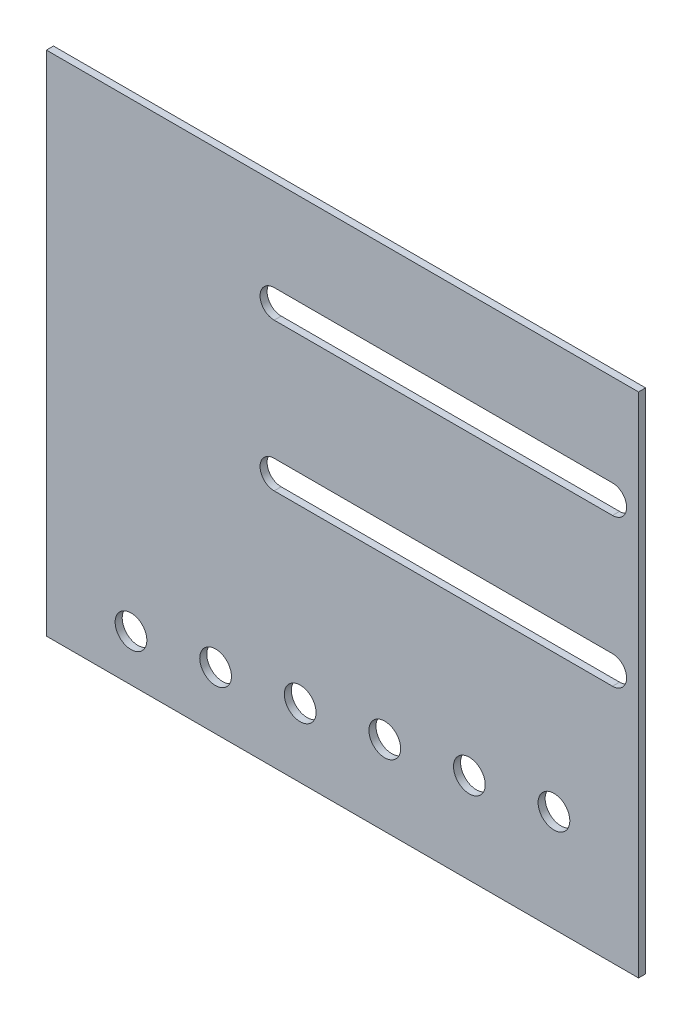
ISO-10303-21;
HEADER;
FILE_DESCRIPTION(('STEP AP214'),'2;1');
FILE_NAME('part.step','',(''),(''),'','','');
FILE_SCHEMA(('AUTOMOTIVE_DESIGN { 1 0 10303 214 1 1 1 1 }'));
ENDSEC;
DATA;
#1=APPLICATION_CONTEXT('core data for automotive mechanical design processes');
#2=APPLICATION_PROTOCOL_DEFINITION('international standard','automotive_design',2000,#1);
#3=PRODUCT_CONTEXT('',#1,'mechanical');
#4=PRODUCT('Part','Part','',(#3));
#5=PRODUCT_RELATED_PRODUCT_CATEGORY('part','',(#4));
#6=PRODUCT_DEFINITION_FORMATION('','',#4);
#7=PRODUCT_DEFINITION_CONTEXT('part definition',#1,'design');
#8=PRODUCT_DEFINITION('design','',#6,#7);
#9=PRODUCT_DEFINITION_SHAPE('','',#8);
#10=(LENGTH_UNIT() NAMED_UNIT(*) SI_UNIT(.MILLI.,.METRE.));
#11=(NAMED_UNIT(*) PLANE_ANGLE_UNIT() SI_UNIT($,.RADIAN.));
#12=(NAMED_UNIT(*) SI_UNIT($,.STERADIAN.) SOLID_ANGLE_UNIT());
#13=UNCERTAINTY_MEASURE_WITH_UNIT(LENGTH_MEASURE(1.E-05),#10,'distance_accuracy_value','');
#14=(GEOMETRIC_REPRESENTATION_CONTEXT(3) GLOBAL_UNCERTAINTY_ASSIGNED_CONTEXT((#13)) GLOBAL_UNIT_ASSIGNED_CONTEXT((#10,
#11,#12)) REPRESENTATION_CONTEXT('',''));
#15=CARTESIAN_POINT('',(0.,0.,0.));
#16=DIRECTION('',(0.,0.,1.));
#17=DIRECTION('',(1.,0.,0.));
#18=AXIS2_PLACEMENT_3D('',#15,#16,#17);
#19=CARTESIAN_POINT('',(0.,0.,6.35));
#20=DIRECTION('',(0.,0.,-1.));
#21=DIRECTION('',(-1.,0.,0.));
#22=AXIS2_PLACEMENT_3D('',#19,#20,#21);
#23=PLANE('',#22);
#24=CARTESIAN_POINT('',(190.5,-136.944186204987,6.35));
#25=DIRECTION('',(0.,0.,-1.));
#26=DIRECTION('',(-1.,0.,0.));
#27=AXIS2_PLACEMENT_3D('',#24,#25,#26);
#28=CIRCLE('',#27,14.2875);
#29=CARTESIAN_POINT('',(176.2125,-136.944186204987,6.35));
#30=VERTEX_POINT('',#29);
#31=EDGE_CURVE('E203',#30,#30,#28,.T.);
#32=ORIENTED_EDGE('',*,*,#31,.T.);
#33=EDGE_LOOP('',(#32));
#34=FACE_BOUND('',#33,.T.);
#35=CARTESIAN_POINT('',(114.3,-146.888372409974,6.35));
#36=DIRECTION('',(0.,0.,-1.));
#37=DIRECTION('',(-1.,0.,0.));
#38=AXIS2_PLACEMENT_3D('',#35,#36,#37);
#39=CIRCLE('',#38,14.2875);
#40=CARTESIAN_POINT('',(100.0125,-146.888372409974,6.35));
#41=VERTEX_POINT('',#40);
#42=EDGE_CURVE('E473',#41,#41,#39,.T.);
#43=ORIENTED_EDGE('',*,*,#42,.T.);
#44=EDGE_LOOP('',(#43));
#45=FACE_BOUND('',#44,.T.);
#46=CARTESIAN_POINT('',(38.1,-156.83255861496,6.35));
#47=DIRECTION('',(0.,0.,-1.));
#48=DIRECTION('',(-1.,0.,0.));
#49=AXIS2_PLACEMENT_3D('',#46,#47,#48);
#50=CIRCLE('',#49,14.2875);
#51=CARTESIAN_POINT('',(23.8125,-156.83255861496,6.35));
#52=VERTEX_POINT('',#51);
#53=EDGE_CURVE('E475',#52,#52,#50,.T.);
#54=ORIENTED_EDGE('',*,*,#53,.T.);
#55=EDGE_LOOP('',(#54));
#56=FACE_BOUND('',#55,.T.);
#57=CARTESIAN_POINT('',(-38.0999999999999,-166.776744819947,6.35));
#58=DIRECTION('',(0.,0.,-1.));
#59=DIRECTION('',(-1.,0.,0.));
#60=AXIS2_PLACEMENT_3D('',#57,#58,#59);
#61=CIRCLE('',#60,14.2875);
#62=CARTESIAN_POINT('',(-52.3874999999999,-166.776744819947,6.35));
#63=VERTEX_POINT('',#62);
#64=EDGE_CURVE('E480',#63,#63,#61,.T.);
#65=ORIENTED_EDGE('',*,*,#64,.T.);
#66=EDGE_LOOP('',(#65));
#67=FACE_BOUND('',#66,.T.);
#68=CARTESIAN_POINT('',(-114.3,-176.720931024934,6.35));
#69=DIRECTION('',(0.,0.,-1.));
#70=DIRECTION('',(-1.,0.,0.));
#71=AXIS2_PLACEMENT_3D('',#68,#69,#70);
#72=CIRCLE('',#71,14.2875);
#73=CARTESIAN_POINT('',(-128.5875,-176.720931024934,6.35));
#74=VERTEX_POINT('',#73);
#75=EDGE_CURVE('E483',#74,#74,#72,.T.);
#76=ORIENTED_EDGE('',*,*,#75,.T.);
#77=EDGE_LOOP('',(#76));
#78=FACE_BOUND('',#77,.T.);
#79=CARTESIAN_POINT('',(-190.5,-186.665117229921,6.35));
#80=DIRECTION('',(0.,0.,-1.));
#81=DIRECTION('',(-1.,0.,0.));
#82=AXIS2_PLACEMENT_3D('',#79,#80,#81);
#83=CIRCLE('',#82,14.2875);
#84=CARTESIAN_POINT('',(-204.7875,-186.665117229921,6.35));
#85=VERTEX_POINT('',#84);
#86=EDGE_CURVE('E486',#85,#85,#83,.T.);
#87=ORIENTED_EDGE('',*,*,#86,.T.);
#88=EDGE_LOOP('',(#87));
#89=FACE_BOUND('',#88,.T.);
#90=CARTESIAN_POINT('',(-61.5480475102231,133.202211593084,6.35));
#91=DIRECTION('',(0.,0.,1.));
#92=DIRECTION('',(1.,0.,0.));
#93=AXIS2_PLACEMENT_3D('',#90,#91,#92);
#94=CIRCLE('',#93,12.7);
#95=CARTESIAN_POINT('',(-61.5480475102231,145.902211593084,6.35));
#96=VERTEX_POINT('',#95);
#97=CARTESIAN_POINT('',(-61.5480475102231,120.502211593084,6.35));
#98=VERTEX_POINT('',#97);
#99=EDGE_CURVE('E212',#96,#98,#94,.T.);
#100=ORIENTED_EDGE('',*,*,#99,.F.);
#101=DIRECTION('',(1.,0.,0.));
#102=VECTOR('',#101,1.);
#103=CARTESIAN_POINT('',(-61.5480475102231,145.902211593084,6.35));
#104=LINE('',#103,#102);
#105=CARTESIAN_POINT('',(243.251952489777,145.902211593084,6.35));
#106=VERTEX_POINT('',#105);
#107=EDGE_CURVE('E220',#96,#106,#104,.T.);
#108=ORIENTED_EDGE('',*,*,#107,.T.);
#109=CARTESIAN_POINT('',(243.251952489777,133.202211593084,6.35));
#110=DIRECTION('',(0.,0.,1.));
#111=DIRECTION('',(1.,0.,0.));
#112=AXIS2_PLACEMENT_3D('',#109,#110,#111);
#113=CIRCLE('',#112,12.7);
#114=CARTESIAN_POINT('',(243.251952489777,120.502211593084,6.35));
#115=VERTEX_POINT('',#114);
#116=EDGE_CURVE('E217',#115,#106,#113,.T.);
#117=ORIENTED_EDGE('',*,*,#116,.F.);
#118=DIRECTION('',(1.,0.,0.));
#119=VECTOR('',#118,1.);
#120=CARTESIAN_POINT('',(-61.5480475102231,120.502211593084,6.35));
#121=LINE('',#120,#119);
#122=EDGE_CURVE('E214',#98,#115,#121,.T.);
#123=ORIENTED_EDGE('',*,*,#122,.F.);
#124=EDGE_LOOP('',(#100,#108,#117,#123));
#125=FACE_BOUND('',#124,.T.);
#126=DIRECTION('',(1.,0.,0.));
#127=VECTOR('',#126,1.);
#128=CARTESIAN_POINT('',(-266.7,-228.6,6.35));
#129=LINE('',#128,#127);
#130=CARTESIAN_POINT('',(-266.7,-228.6,6.35));
#131=VERTEX_POINT('',#130);
#132=CARTESIAN_POINT('',(266.7,-228.6,6.35));
#133=VERTEX_POINT('',#132);
#134=EDGE_CURVE('E244',#131,#133,#129,.T.);
#135=ORIENTED_EDGE('',*,*,#134,.T.);
#136=DIRECTION('',(0.,-1.,0.));
#137=VECTOR('',#136,1.);
#138=CARTESIAN_POINT('',(266.7,228.6,6.35));
#139=LINE('',#138,#137);
#140=CARTESIAN_POINT('',(266.7,228.6,6.35));
#141=VERTEX_POINT('',#140);
#142=EDGE_CURVE('E246',#141,#133,#139,.T.);
#143=ORIENTED_EDGE('',*,*,#142,.F.);
#144=DIRECTION('',(1.,0.,0.));
#145=VECTOR('',#144,1.);
#146=CARTESIAN_POINT('',(-266.7,228.6,6.35));
#147=LINE('',#146,#145);
#148=CARTESIAN_POINT('',(-266.7,228.6,6.35));
#149=VERTEX_POINT('',#148);
#150=EDGE_CURVE('E250',#149,#141,#147,.T.);
#151=ORIENTED_EDGE('',*,*,#150,.F.);
#152=DIRECTION('',(0.,-1.,0.));
#153=VECTOR('',#152,1.);
#154=CARTESIAN_POINT('',(-266.7,228.6,6.35));
#155=LINE('',#154,#153);
#156=EDGE_CURVE('E253',#149,#131,#155,.T.);
#157=ORIENTED_EDGE('',*,*,#156,.T.);
#158=EDGE_LOOP('',(#135,#143,#151,#157));
#159=FACE_BOUND('',#158,.T.);
#160=CARTESIAN_POINT('',(-61.5480475102231,0.,6.35));
#161=DIRECTION('',(0.,0.,1.));
#162=DIRECTION('',(1.,0.,0.));
#163=AXIS2_PLACEMENT_3D('',#160,#161,#162);
#164=CIRCLE('',#163,12.7);
#165=CARTESIAN_POINT('',(-61.5480475102231,12.7,6.35));
#166=VERTEX_POINT('',#165);
#167=CARTESIAN_POINT('',(-61.5480475102231,-12.7,6.35));
#168=VERTEX_POINT('',#167);
#169=EDGE_CURVE('E175',#166,#168,#164,.T.);
#170=ORIENTED_EDGE('',*,*,#169,.F.);
#171=DIRECTION('',(1.,0.,0.));
#172=VECTOR('',#171,1.);
#173=CARTESIAN_POINT('',(-61.5480475102231,12.7,6.35));
#174=LINE('',#173,#172);
#175=CARTESIAN_POINT('',(243.251952489777,12.7,6.35));
#176=VERTEX_POINT('',#175);
#177=EDGE_CURVE('E197',#166,#176,#174,.T.);
#178=ORIENTED_EDGE('',*,*,#177,.T.);
#179=CARTESIAN_POINT('',(243.251952489777,0.,6.35));
#180=DIRECTION('',(0.,0.,1.));
#181=DIRECTION('',(1.,0.,0.));
#182=AXIS2_PLACEMENT_3D('',#179,#180,#181);
#183=CIRCLE('',#182,12.7);
#184=CARTESIAN_POINT('',(243.251952489777,-12.7,6.35));
#185=VERTEX_POINT('',#184);
#186=EDGE_CURVE('E195',#185,#176,#183,.T.);
#187=ORIENTED_EDGE('',*,*,#186,.F.);
#188=DIRECTION('',(1.,0.,0.));
#189=VECTOR('',#188,1.);
#190=CARTESIAN_POINT('',(-61.5480475102231,-12.7,6.35));
#191=LINE('',#190,#189);
#192=EDGE_CURVE('E183',#168,#185,#191,.T.);
#193=ORIENTED_EDGE('',*,*,#192,.F.);
#194=EDGE_LOOP('',(#170,#178,#187,#193));
#195=FACE_BOUND('',#194,.T.);
#196=ADVANCED_FACE('F87',(#34,#45,#56,#67,#78,#89,#125,#159,#195),#23,.F.);
#197=CARTESIAN_POINT('',(0.,0.,0.));
#198=DIRECTION('',(0.,0.,-1.));
#199=DIRECTION('',(-1.,0.,0.));
#200=AXIS2_PLACEMENT_3D('',#197,#198,#199);
#201=PLANE('',#200);
#202=CARTESIAN_POINT('',(190.5,-136.944186204987,0.));
#203=DIRECTION('',(0.,0.,-1.));
#204=DIRECTION('',(-1.,0.,0.));
#205=AXIS2_PLACEMENT_3D('',#202,#203,#204);
#206=CIRCLE('',#205,14.2875);
#207=CARTESIAN_POINT('',(176.2125,-136.944186204987,0.));
#208=VERTEX_POINT('',#207);
#209=EDGE_CURVE('E471',#208,#208,#206,.T.);
#210=ORIENTED_EDGE('',*,*,#209,.F.);
#211=EDGE_LOOP('',(#210));
#212=FACE_BOUND('',#211,.T.);
#213=CARTESIAN_POINT('',(114.3,-146.888372409974,0.));
#214=DIRECTION('',(0.,0.,-1.));
#215=DIRECTION('',(-1.,0.,0.));
#216=AXIS2_PLACEMENT_3D('',#213,#214,#215);
#217=CIRCLE('',#216,14.2875);
#218=CARTESIAN_POINT('',(100.0125,-146.888372409974,0.));
#219=VERTEX_POINT('',#218);
#220=EDGE_CURVE('E501',#219,#219,#217,.T.);
#221=ORIENTED_EDGE('',*,*,#220,.F.);
#222=EDGE_LOOP('',(#221));
#223=FACE_BOUND('',#222,.T.);
#224=CARTESIAN_POINT('',(38.1,-156.83255861496,0.));
#225=DIRECTION('',(0.,0.,-1.));
#226=DIRECTION('',(-1.,0.,0.));
#227=AXIS2_PLACEMENT_3D('',#224,#225,#226);
#228=CIRCLE('',#227,14.2875);
#229=CARTESIAN_POINT('',(23.8125,-156.83255861496,0.));
#230=VERTEX_POINT('',#229);
#231=EDGE_CURVE('E498',#230,#230,#228,.T.);
#232=ORIENTED_EDGE('',*,*,#231,.F.);
#233=EDGE_LOOP('',(#232));
#234=FACE_BOUND('',#233,.T.);
#235=CARTESIAN_POINT('',(-38.0999999999999,-166.776744819947,0.));
#236=DIRECTION('',(0.,0.,-1.));
#237=DIRECTION('',(-1.,0.,0.));
#238=AXIS2_PLACEMENT_3D('',#235,#236,#237);
#239=CIRCLE('',#238,14.2875);
#240=CARTESIAN_POINT('',(-52.3874999999999,-166.776744819947,0.));
#241=VERTEX_POINT('',#240);
#242=EDGE_CURVE('E495',#241,#241,#239,.T.);
#243=ORIENTED_EDGE('',*,*,#242,.F.);
#244=EDGE_LOOP('',(#243));
#245=FACE_BOUND('',#244,.T.);
#246=CARTESIAN_POINT('',(-114.3,-176.720931024934,0.));
#247=DIRECTION('',(0.,0.,-1.));
#248=DIRECTION('',(-1.,0.,0.));
#249=AXIS2_PLACEMENT_3D('',#246,#247,#248);
#250=CIRCLE('',#249,14.2875);
#251=CARTESIAN_POINT('',(-128.5875,-176.720931024934,0.));
#252=VERTEX_POINT('',#251);
#253=EDGE_CURVE('E492',#252,#252,#250,.T.);
#254=ORIENTED_EDGE('',*,*,#253,.F.);
#255=EDGE_LOOP('',(#254));
#256=FACE_BOUND('',#255,.T.);
#257=CARTESIAN_POINT('',(-190.5,-186.665117229921,0.));
#258=DIRECTION('',(0.,0.,-1.));
#259=DIRECTION('',(-1.,0.,0.));
#260=AXIS2_PLACEMENT_3D('',#257,#258,#259);
#261=CIRCLE('',#260,14.2875);
#262=CARTESIAN_POINT('',(-204.7875,-186.665117229921,0.));
#263=VERTEX_POINT('',#262);
#264=EDGE_CURVE('E489',#263,#263,#261,.T.);
#265=ORIENTED_EDGE('',*,*,#264,.F.);
#266=EDGE_LOOP('',(#265));
#267=FACE_BOUND('',#266,.T.);
#268=DIRECTION('',(1.,0.,0.));
#269=VECTOR('',#268,1.);
#270=CARTESIAN_POINT('',(-266.7,-228.6,0.));
#271=LINE('',#270,#269);
#272=CARTESIAN_POINT('',(-266.7,-228.6,0.));
#273=VERTEX_POINT('',#272);
#274=CARTESIAN_POINT('',(266.7,-228.6,0.));
#275=VERTEX_POINT('',#274);
#276=EDGE_CURVE('E243',#273,#275,#271,.T.);
#277=ORIENTED_EDGE('',*,*,#276,.F.);
#278=DIRECTION('',(0.,-1.,0.));
#279=VECTOR('',#278,1.);
#280=CARTESIAN_POINT('',(-266.7,228.6,0.));
#281=LINE('',#280,#279);
#282=CARTESIAN_POINT('',(-266.7,228.6,0.));
#283=VERTEX_POINT('',#282);
#284=EDGE_CURVE('E247',#283,#273,#281,.T.);
#285=ORIENTED_EDGE('',*,*,#284,.F.);
#286=DIRECTION('',(1.,0.,0.));
#287=VECTOR('',#286,1.);
#288=CARTESIAN_POINT('',(-266.7,228.6,0.));
#289=LINE('',#288,#287);
#290=CARTESIAN_POINT('',(266.7,228.6,0.));
#291=VERTEX_POINT('',#290);
#292=EDGE_CURVE('E261',#283,#291,#289,.T.);
#293=ORIENTED_EDGE('',*,*,#292,.T.);
#294=DIRECTION('',(0.,-1.,0.));
#295=VECTOR('',#294,1.);
#296=CARTESIAN_POINT('',(266.7,228.6,0.));
#297=LINE('',#296,#295);
#298=EDGE_CURVE('E258',#291,#275,#297,.T.);
#299=ORIENTED_EDGE('',*,*,#298,.T.);
#300=EDGE_LOOP('',(#277,#285,#293,#299));
#301=FACE_BOUND('',#300,.T.);
#302=DIRECTION('',(1.,0.,0.));
#303=VECTOR('',#302,1.);
#304=CARTESIAN_POINT('',(-61.5480475102231,145.902211593084,0.));
#305=LINE('',#304,#303);
#306=CARTESIAN_POINT('',(-61.5480475102231,145.902211593084,0.));
#307=VERTEX_POINT('',#306);
#308=CARTESIAN_POINT('',(243.251952489777,145.902211593084,0.));
#309=VERTEX_POINT('',#308);
#310=EDGE_CURVE('E215',#307,#309,#305,.T.);
#311=ORIENTED_EDGE('',*,*,#310,.F.);
#312=CARTESIAN_POINT('',(-61.5480475102231,133.202211593084,0.));
#313=DIRECTION('',(0.,0.,1.));
#314=DIRECTION('',(1.,0.,0.));
#315=AXIS2_PLACEMENT_3D('',#312,#313,#314);
#316=CIRCLE('',#315,12.7);
#317=CARTESIAN_POINT('',(-61.5480475102231,120.502211593084,0.));
#318=VERTEX_POINT('',#317);
#319=EDGE_CURVE('E191',#307,#318,#316,.T.);
#320=ORIENTED_EDGE('',*,*,#319,.T.);
#321=DIRECTION('',(1.,0.,0.));
#322=VECTOR('',#321,1.);
#323=CARTESIAN_POINT('',(-61.5480475102231,120.502211593084,0.));
#324=LINE('',#323,#322);
#325=CARTESIAN_POINT('',(243.251952489777,120.502211593084,0.));
#326=VERTEX_POINT('',#325);
#327=EDGE_CURVE('E226',#318,#326,#324,.T.);
#328=ORIENTED_EDGE('',*,*,#327,.T.);
#329=CARTESIAN_POINT('',(243.251952489777,133.202211593084,0.));
#330=DIRECTION('',(0.,0.,1.));
#331=DIRECTION('',(1.,0.,0.));
#332=AXIS2_PLACEMENT_3D('',#329,#330,#331);
#333=CIRCLE('',#332,12.7);
#334=EDGE_CURVE('E229',#326,#309,#333,.T.);
#335=ORIENTED_EDGE('',*,*,#334,.T.);
#336=EDGE_LOOP('',(#311,#320,#328,#335));
#337=FACE_BOUND('',#336,.T.);
#338=DIRECTION('',(1.,0.,0.));
#339=VECTOR('',#338,1.);
#340=CARTESIAN_POINT('',(-61.5480475102231,12.7,0.));
#341=LINE('',#340,#339);
#342=CARTESIAN_POINT('',(-61.5480475102231,12.7,0.));
#343=VERTEX_POINT('',#342);
#344=CARTESIAN_POINT('',(243.251952489777,12.7,0.));
#345=VERTEX_POINT('',#344);
#346=EDGE_CURVE('E184',#343,#345,#341,.T.);
#347=ORIENTED_EDGE('',*,*,#346,.F.);
#348=CARTESIAN_POINT('',(-61.5480475102231,0.,0.));
#349=DIRECTION('',(0.,0.,1.));
#350=DIRECTION('',(1.,0.,0.));
#351=AXIS2_PLACEMENT_3D('',#348,#349,#350);
#352=CIRCLE('',#351,12.7);
#353=CARTESIAN_POINT('',(-61.5480475102231,-12.7,0.));
#354=VERTEX_POINT('',#353);
#355=EDGE_CURVE('E110',#343,#354,#352,.T.);
#356=ORIENTED_EDGE('',*,*,#355,.T.);
#357=DIRECTION('',(1.,0.,0.));
#358=VECTOR('',#357,1.);
#359=CARTESIAN_POINT('',(-61.5480475102231,-12.7,0.));
#360=LINE('',#359,#358);
#361=CARTESIAN_POINT('',(243.251952489777,-12.7,0.));
#362=VERTEX_POINT('',#361);
#363=EDGE_CURVE('E190',#354,#362,#360,.T.);
#364=ORIENTED_EDGE('',*,*,#363,.T.);
#365=CARTESIAN_POINT('',(243.251952489777,0.,0.));
#366=DIRECTION('',(0.,0.,1.));
#367=DIRECTION('',(1.,0.,0.));
#368=AXIS2_PLACEMENT_3D('',#365,#366,#367);
#369=CIRCLE('',#368,12.7);
#370=EDGE_CURVE('E205',#362,#345,#369,.T.);
#371=ORIENTED_EDGE('',*,*,#370,.T.);
#372=EDGE_LOOP('',(#347,#356,#364,#371));
#373=FACE_BOUND('',#372,.T.);
#374=ADVANCED_FACE('F280',(#212,#223,#234,#245,#256,#267,#301,#337,#373),#201,.T.);
#375=CARTESIAN_POINT('',(-266.7,-228.6,6.35));
#376=DIRECTION('',(0.,1.,0.));
#377=DIRECTION('',(-1.,0.,0.));
#378=AXIS2_PLACEMENT_3D('',#375,#376,#377);
#379=PLANE('',#378);
#380=ORIENTED_EDGE('',*,*,#276,.T.);
#381=DIRECTION('',(0.,0.,-1.));
#382=VECTOR('',#381,1.);
#383=CARTESIAN_POINT('',(266.7,-228.6,6.35));
#384=LINE('',#383,#382);
#385=EDGE_CURVE('E12',#133,#275,#384,.T.);
#386=ORIENTED_EDGE('',*,*,#385,.F.);
#387=ORIENTED_EDGE('',*,*,#134,.F.);
#388=DIRECTION('',(0.,0.,-1.));
#389=VECTOR('',#388,1.);
#390=CARTESIAN_POINT('',(-266.7,-228.6,6.35));
#391=LINE('',#390,#389);
#392=EDGE_CURVE('E255',#131,#273,#391,.T.);
#393=ORIENTED_EDGE('',*,*,#392,.T.);
#394=EDGE_LOOP('',(#380,#386,#387,#393));
#395=FACE_BOUND('',#394,.T.);
#396=ADVANCED_FACE('F89',(#395),#379,.F.);
#397=CARTESIAN_POINT('',(266.7,228.6,6.35));
#398=DIRECTION('',(1.,0.,0.));
#399=DIRECTION('',(0.,1.,0.));
#400=AXIS2_PLACEMENT_3D('',#397,#398,#399);
#401=PLANE('',#400);
#402=ORIENTED_EDGE('',*,*,#298,.F.);
#403=DIRECTION('',(0.,0.,-1.));
#404=VECTOR('',#403,1.);
#405=CARTESIAN_POINT('',(266.7,228.6,6.35));
#406=LINE('',#405,#404);
#407=EDGE_CURVE('E95',#141,#291,#406,.T.);
#408=ORIENTED_EDGE('',*,*,#407,.F.);
#409=ORIENTED_EDGE('',*,*,#142,.T.);
#410=ORIENTED_EDGE('',*,*,#385,.T.);
#411=EDGE_LOOP('',(#402,#408,#409,#410));
#412=FACE_BOUND('',#411,.T.);
#413=ADVANCED_FACE('F275',(#412),#401,.T.);
#414=CARTESIAN_POINT('',(-266.7,228.6,6.35));
#415=DIRECTION('',(0.,1.,0.));
#416=DIRECTION('',(-1.,0.,0.));
#417=AXIS2_PLACEMENT_3D('',#414,#415,#416);
#418=PLANE('',#417);
#419=ORIENTED_EDGE('',*,*,#292,.F.);
#420=DIRECTION('',(0.,0.,-1.));
#421=VECTOR('',#420,1.);
#422=CARTESIAN_POINT('',(-266.7,228.6,6.35));
#423=LINE('',#422,#421);
#424=EDGE_CURVE('E267',#149,#283,#423,.T.);
#425=ORIENTED_EDGE('',*,*,#424,.F.);
#426=ORIENTED_EDGE('',*,*,#150,.T.);
#427=ORIENTED_EDGE('',*,*,#407,.T.);
#428=EDGE_LOOP('',(#419,#425,#426,#427));
#429=FACE_BOUND('',#428,.T.);
#430=ADVANCED_FACE('F271',(#429),#418,.T.);
#431=CARTESIAN_POINT('',(-266.7,228.6,6.35));
#432=DIRECTION('',(1.,0.,0.));
#433=DIRECTION('',(0.,1.,0.));
#434=AXIS2_PLACEMENT_3D('',#431,#432,#433);
#435=PLANE('',#434);
#436=ORIENTED_EDGE('',*,*,#284,.T.);
#437=ORIENTED_EDGE('',*,*,#392,.F.);
#438=ORIENTED_EDGE('',*,*,#156,.F.);
#439=ORIENTED_EDGE('',*,*,#424,.T.);
#440=EDGE_LOOP('',(#436,#437,#438,#439));
#441=FACE_BOUND('',#440,.T.);
#442=ADVANCED_FACE('F284',(#441),#435,.F.);
#443=CARTESIAN_POINT('',(-61.5480475102231,133.202211593084,6.35));
#444=DIRECTION('',(0.,0.,-1.));
#445=DIRECTION('',(-1.,0.,0.));
#446=AXIS2_PLACEMENT_3D('',#443,#444,#445);
#447=CYLINDRICAL_SURFACE('',#446,12.7);
#448=ORIENTED_EDGE('',*,*,#319,.F.);
#449=DIRECTION('',(0.,0.,-1.));
#450=VECTOR('',#449,1.);
#451=CARTESIAN_POINT('',(-61.5480475102231,145.902211593084,6.35));
#452=LINE('',#451,#450);
#453=EDGE_CURVE('E223',#96,#307,#452,.T.);
#454=ORIENTED_EDGE('',*,*,#453,.F.);
#455=ORIENTED_EDGE('',*,*,#99,.T.);
#456=DIRECTION('',(0.,0.,-1.));
#457=VECTOR('',#456,1.);
#458=CARTESIAN_POINT('',(-61.5480475102231,120.502211593084,6.35));
#459=LINE('',#458,#457);
#460=EDGE_CURVE('E240',#98,#318,#459,.T.);
#461=ORIENTED_EDGE('',*,*,#460,.T.);
#462=EDGE_LOOP('',(#448,#454,#455,#461));
#463=FACE_BOUND('',#462,.T.);
#464=ADVANCED_FACE('F301',(#463),#447,.F.);
#465=CARTESIAN_POINT('',(-61.5480475102231,120.502211593084,6.35));
#466=DIRECTION('',(0.,1.,0.));
#467=DIRECTION('',(0.,0.,1.));
#468=AXIS2_PLACEMENT_3D('',#465,#466,#467);
#469=PLANE('',#468);
#470=ORIENTED_EDGE('',*,*,#327,.F.);
#471=ORIENTED_EDGE('',*,*,#460,.F.);
#472=ORIENTED_EDGE('',*,*,#122,.T.);
#473=DIRECTION('',(0.,0.,-1.));
#474=VECTOR('',#473,1.);
#475=CARTESIAN_POINT('',(243.251952489777,120.502211593084,6.35));
#476=LINE('',#475,#474);
#477=EDGE_CURVE('E238',#115,#326,#476,.T.);
#478=ORIENTED_EDGE('',*,*,#477,.T.);
#479=EDGE_LOOP('',(#470,#471,#472,#478));
#480=FACE_BOUND('',#479,.T.);
#481=ADVANCED_FACE('F343',(#480),#469,.T.);
#482=CARTESIAN_POINT('',(243.251952489777,133.202211593084,6.35));
#483=DIRECTION('',(0.,0.,-1.));
#484=DIRECTION('',(-1.,0.,0.));
#485=AXIS2_PLACEMENT_3D('',#482,#483,#484);
#486=CYLINDRICAL_SURFACE('',#485,12.7);
#487=ORIENTED_EDGE('',*,*,#334,.F.);
#488=ORIENTED_EDGE('',*,*,#477,.F.);
#489=ORIENTED_EDGE('',*,*,#116,.T.);
#490=DIRECTION('',(0.,0.,-1.));
#491=VECTOR('',#490,1.);
#492=CARTESIAN_POINT('',(243.251952489777,145.902211593084,6.35));
#493=LINE('',#492,#491);
#494=EDGE_CURVE('E236',#106,#309,#493,.T.);
#495=ORIENTED_EDGE('',*,*,#494,.T.);
#496=EDGE_LOOP('',(#487,#488,#489,#495));
#497=FACE_BOUND('',#496,.T.);
#498=ADVANCED_FACE('F352',(#497),#486,.F.);
#499=CARTESIAN_POINT('',(-61.5480475102231,145.902211593084,6.35));
#500=DIRECTION('',(0.,1.,0.));
#501=DIRECTION('',(0.,0.,1.));
#502=AXIS2_PLACEMENT_3D('',#499,#500,#501);
#503=PLANE('',#502);
#504=ORIENTED_EDGE('',*,*,#310,.T.);
#505=ORIENTED_EDGE('',*,*,#494,.F.);
#506=ORIENTED_EDGE('',*,*,#107,.F.);
#507=ORIENTED_EDGE('',*,*,#453,.T.);
#508=EDGE_LOOP('',(#504,#505,#506,#507));
#509=FACE_BOUND('',#508,.T.);
#510=ADVANCED_FACE('F361',(#509),#503,.F.);
#511=CARTESIAN_POINT('',(-61.5480475102231,0.,6.35));
#512=DIRECTION('',(0.,0.,-1.));
#513=DIRECTION('',(-1.,0.,0.));
#514=AXIS2_PLACEMENT_3D('',#511,#512,#513);
#515=CYLINDRICAL_SURFACE('',#514,12.7);
#516=ORIENTED_EDGE('',*,*,#355,.F.);
#517=DIRECTION('',(0.,0.,-1.));
#518=VECTOR('',#517,1.);
#519=CARTESIAN_POINT('',(-61.5480475102231,12.7,6.35));
#520=LINE('',#519,#518);
#521=EDGE_CURVE('E179',#166,#343,#520,.T.);
#522=ORIENTED_EDGE('',*,*,#521,.F.);
#523=ORIENTED_EDGE('',*,*,#169,.T.);
#524=DIRECTION('',(0.,0.,-1.));
#525=VECTOR('',#524,1.);
#526=CARTESIAN_POINT('',(-61.5480475102231,-12.7,6.35));
#527=LINE('',#526,#525);
#528=EDGE_CURVE('E178',#168,#354,#527,.T.);
#529=ORIENTED_EDGE('',*,*,#528,.T.);
#530=EDGE_LOOP('',(#516,#522,#523,#529));
#531=FACE_BOUND('',#530,.T.);
#532=ADVANCED_FACE('F177',(#531),#515,.F.);
#533=CARTESIAN_POINT('',(-61.5480475102231,-12.7,6.35));
#534=DIRECTION('',(0.,1.,0.));
#535=DIRECTION('',(-1.,0.,0.));
#536=AXIS2_PLACEMENT_3D('',#533,#534,#535);
#537=PLANE('',#536);
#538=ORIENTED_EDGE('',*,*,#363,.F.);
#539=ORIENTED_EDGE('',*,*,#528,.F.);
#540=ORIENTED_EDGE('',*,*,#192,.T.);
#541=DIRECTION('',(0.,0.,-1.));
#542=VECTOR('',#541,1.);
#543=CARTESIAN_POINT('',(243.251952489777,-12.7,6.35));
#544=LINE('',#543,#542);
#545=EDGE_CURVE('E192',#185,#362,#544,.T.);
#546=ORIENTED_EDGE('',*,*,#545,.T.);
#547=EDGE_LOOP('',(#538,#539,#540,#546));
#548=FACE_BOUND('',#547,.T.);
#549=ADVANCED_FACE('F187',(#548),#537,.T.);
#550=CARTESIAN_POINT('',(243.251952489777,0.,6.35));
#551=DIRECTION('',(0.,0.,-1.));
#552=DIRECTION('',(-1.,0.,0.));
#553=AXIS2_PLACEMENT_3D('',#550,#551,#552);
#554=CYLINDRICAL_SURFACE('',#553,12.7);
#555=ORIENTED_EDGE('',*,*,#370,.F.);
#556=ORIENTED_EDGE('',*,*,#545,.F.);
#557=ORIENTED_EDGE('',*,*,#186,.T.);
#558=DIRECTION('',(0.,0.,-1.));
#559=VECTOR('',#558,1.);
#560=CARTESIAN_POINT('',(243.251952489777,12.7,6.35));
#561=LINE('',#560,#559);
#562=EDGE_CURVE('E102',#176,#345,#561,.T.);
#563=ORIENTED_EDGE('',*,*,#562,.T.);
#564=EDGE_LOOP('',(#555,#556,#557,#563));
#565=FACE_BOUND('',#564,.T.);
#566=ADVANCED_FACE('F388',(#565),#554,.F.);
#567=CARTESIAN_POINT('',(-61.5480475102231,12.7,6.35));
#568=DIRECTION('',(0.,1.,0.));
#569=DIRECTION('',(-1.,0.,0.));
#570=AXIS2_PLACEMENT_3D('',#567,#568,#569);
#571=PLANE('',#570);
#572=ORIENTED_EDGE('',*,*,#346,.T.);
#573=ORIENTED_EDGE('',*,*,#562,.F.);
#574=ORIENTED_EDGE('',*,*,#177,.F.);
#575=ORIENTED_EDGE('',*,*,#521,.T.);
#576=EDGE_LOOP('',(#572,#573,#574,#575));
#577=FACE_BOUND('',#576,.T.);
#578=ADVANCED_FACE('F397',(#577),#571,.F.);
#579=CARTESIAN_POINT('',(-190.5,-186.665117229921,12.7));
#580=DIRECTION('',(0.,0.,-1.));
#581=DIRECTION('',(-1.,0.,0.));
#582=AXIS2_PLACEMENT_3D('',#579,#580,#581);
#583=CYLINDRICAL_SURFACE('',#582,14.2875);
#584=ORIENTED_EDGE('',*,*,#264,.T.);
#585=EDGE_LOOP('',(#584));
#586=FACE_BOUND('',#585,.T.);
#587=ORIENTED_EDGE('',*,*,#86,.F.);
#588=EDGE_LOOP('',(#587));
#589=FACE_BOUND('',#588,.T.);
#590=ADVANCED_FACE('F406',(#586,#589),#583,.F.);
#591=CARTESIAN_POINT('',(-114.3,-176.720931024934,12.7));
#592=DIRECTION('',(0.,0.,-1.));
#593=DIRECTION('',(-1.,0.,0.));
#594=AXIS2_PLACEMENT_3D('',#591,#592,#593);
#595=CYLINDRICAL_SURFACE('',#594,14.2875);
#596=ORIENTED_EDGE('',*,*,#253,.T.);
#597=EDGE_LOOP('',(#596));
#598=FACE_BOUND('',#597,.T.);
#599=ORIENTED_EDGE('',*,*,#75,.F.);
#600=EDGE_LOOP('',(#599));
#601=FACE_BOUND('',#600,.T.);
#602=ADVANCED_FACE('F415',(#598,#601),#595,.F.);
#603=CARTESIAN_POINT('',(-38.0999999999999,-166.776744819947,12.7));
#604=DIRECTION('',(0.,0.,-1.));
#605=DIRECTION('',(-1.,0.,0.));
#606=AXIS2_PLACEMENT_3D('',#603,#604,#605);
#607=CYLINDRICAL_SURFACE('',#606,14.2875);
#608=ORIENTED_EDGE('',*,*,#242,.T.);
#609=EDGE_LOOP('',(#608));
#610=FACE_BOUND('',#609,.T.);
#611=ORIENTED_EDGE('',*,*,#64,.F.);
#612=EDGE_LOOP('',(#611));
#613=FACE_BOUND('',#612,.T.);
#614=ADVANCED_FACE('F425',(#610,#613),#607,.F.);
#615=CARTESIAN_POINT('',(38.1,-156.83255861496,12.7));
#616=DIRECTION('',(0.,0.,-1.));
#617=DIRECTION('',(-1.,0.,0.));
#618=AXIS2_PLACEMENT_3D('',#615,#616,#617);
#619=CYLINDRICAL_SURFACE('',#618,14.2875);
#620=ORIENTED_EDGE('',*,*,#231,.T.);
#621=EDGE_LOOP('',(#620));
#622=FACE_BOUND('',#621,.T.);
#623=ORIENTED_EDGE('',*,*,#53,.F.);
#624=EDGE_LOOP('',(#623));
#625=FACE_BOUND('',#624,.T.);
#626=ADVANCED_FACE('F435',(#622,#625),#619,.F.);
#627=CARTESIAN_POINT('',(114.3,-146.888372409974,12.7));
#628=DIRECTION('',(0.,0.,-1.));
#629=DIRECTION('',(-1.,0.,0.));
#630=AXIS2_PLACEMENT_3D('',#627,#628,#629);
#631=CYLINDRICAL_SURFACE('',#630,14.2875);
#632=ORIENTED_EDGE('',*,*,#220,.T.);
#633=EDGE_LOOP('',(#632));
#634=FACE_BOUND('',#633,.T.);
#635=ORIENTED_EDGE('',*,*,#42,.F.);
#636=EDGE_LOOP('',(#635));
#637=FACE_BOUND('',#636,.T.);
#638=ADVANCED_FACE('F445',(#634,#637),#631,.F.);
#639=CARTESIAN_POINT('',(190.5,-136.944186204987,12.7));
#640=DIRECTION('',(0.,0.,-1.));
#641=DIRECTION('',(-1.,0.,0.));
#642=AXIS2_PLACEMENT_3D('',#639,#640,#641);
#643=CYLINDRICAL_SURFACE('',#642,14.2875);
#644=ORIENTED_EDGE('',*,*,#209,.T.);
#645=EDGE_LOOP('',(#644));
#646=FACE_BOUND('',#645,.T.);
#647=ORIENTED_EDGE('',*,*,#31,.F.);
#648=EDGE_LOOP('',(#647));
#649=FACE_BOUND('',#648,.T.);
#650=ADVANCED_FACE('F455',(#646,#649),#643,.F.);
#651=CLOSED_SHELL('',(#196,#374,#396,#413,#430,#442,#464,#481,#498,#510,#532,#549,#566,#578,
#590,#602,#614,#626,#638,#650));
#652=MANIFOLD_SOLID_BREP('B2',#651);
#653=ADVANCED_BREP_SHAPE_REPRESENTATION('',(#18,#652),#14);
#654=SHAPE_DEFINITION_REPRESENTATION(#9,#653);
ENDSEC;
END-ISO-10303-21;
